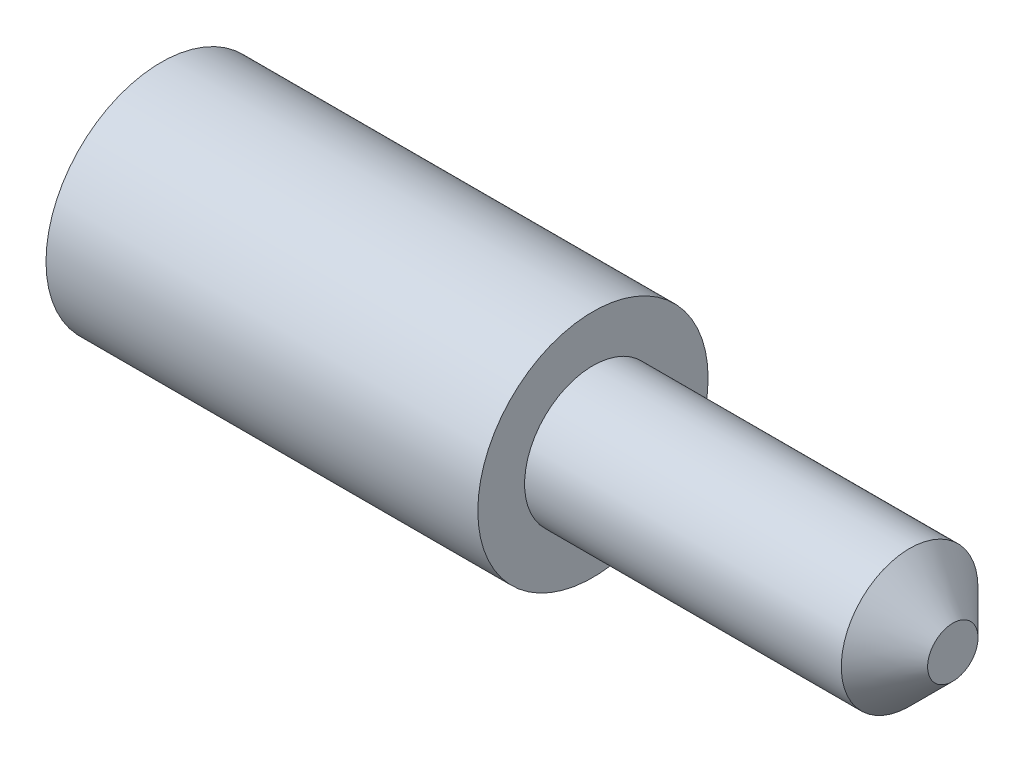
ISO-10303-21;
HEADER;
FILE_DESCRIPTION(('STEP AP214'),'2;1');
FILE_NAME('part.step','',(''),(''),'','','');
FILE_SCHEMA(('AUTOMOTIVE_DESIGN { 1 0 10303 214 1 1 1 1 }'));
ENDSEC;
DATA;
#1=APPLICATION_CONTEXT('core data for automotive mechanical design processes');
#2=APPLICATION_PROTOCOL_DEFINITION('international standard','automotive_design',2000,#1);
#3=PRODUCT_CONTEXT('',#1,'mechanical');
#4=PRODUCT('Part','Part','',(#3));
#5=PRODUCT_RELATED_PRODUCT_CATEGORY('part','',(#4));
#6=PRODUCT_DEFINITION_FORMATION('','',#4);
#7=PRODUCT_DEFINITION_CONTEXT('part definition',#1,'design');
#8=PRODUCT_DEFINITION('design','',#6,#7);
#9=PRODUCT_DEFINITION_SHAPE('','',#8);
#10=(LENGTH_UNIT() NAMED_UNIT(*) SI_UNIT(.MILLI.,.METRE.));
#11=(NAMED_UNIT(*) PLANE_ANGLE_UNIT() SI_UNIT($,.RADIAN.));
#12=(NAMED_UNIT(*) SI_UNIT($,.STERADIAN.) SOLID_ANGLE_UNIT());
#13=UNCERTAINTY_MEASURE_WITH_UNIT(LENGTH_MEASURE(1.E-05),#10,'distance_accuracy_value','');
#14=(GEOMETRIC_REPRESENTATION_CONTEXT(3) GLOBAL_UNCERTAINTY_ASSIGNED_CONTEXT((#13)) GLOBAL_UNIT_ASSIGNED_CONTEXT((#10,
#11,#12)) REPRESENTATION_CONTEXT('',''));
#15=CARTESIAN_POINT('',(0.,0.,0.));
#16=DIRECTION('',(0.,0.,1.));
#17=DIRECTION('',(1.,0.,0.));
#18=AXIS2_PLACEMENT_3D('',#15,#16,#17);
#19=CARTESIAN_POINT('',(-30.,0.,0.));
#20=DIRECTION('',(1.,0.,0.));
#21=DIRECTION('',(0.,0.,-1.));
#22=AXIS2_PLACEMENT_3D('',#19,#20,#21);
#23=CYLINDRICAL_SURFACE('',#22,8.);
#24=CARTESIAN_POINT('',(-30.,0.,0.));
#25=DIRECTION('',(1.,0.,0.));
#26=DIRECTION('',(0.,0.,-1.));
#27=AXIS2_PLACEMENT_3D('',#24,#25,#26);
#28=CIRCLE('',#27,8.);
#29=CARTESIAN_POINT('',(-30.,0.,-8.));
#30=VERTEX_POINT('',#29);
#31=EDGE_CURVE('E51',#30,#30,#28,.T.);
#32=ORIENTED_EDGE('',*,*,#31,.T.);
#33=EDGE_LOOP('',(#32));
#34=FACE_BOUND('',#33,.T.);
#35=CARTESIAN_POINT('',(0.,0.,0.));
#36=DIRECTION('',(1.,0.,0.));
#37=DIRECTION('',(0.,0.,-1.));
#38=AXIS2_PLACEMENT_3D('',#35,#36,#37);
#39=CIRCLE('',#38,8.);
#40=CARTESIAN_POINT('',(0.,0.,-8.));
#41=VERTEX_POINT('',#40);
#42=EDGE_CURVE('E54',#41,#41,#39,.T.);
#43=ORIENTED_EDGE('',*,*,#42,.F.);
#44=EDGE_LOOP('',(#43));
#45=FACE_BOUND('',#44,.T.);
#46=ADVANCED_FACE('F35',(#34,#45),#23,.T.);
#47=CARTESIAN_POINT('',(-30.,0.,0.));
#48=DIRECTION('',(1.,0.,0.));
#49=DIRECTION('',(0.,0.,-1.));
#50=AXIS2_PLACEMENT_3D('',#47,#48,#49);
#51=PLANE('',#50);
#52=ORIENTED_EDGE('',*,*,#31,.F.);
#53=EDGE_LOOP('',(#52));
#54=FACE_BOUND('',#53,.T.);
#55=ADVANCED_FACE('F62',(#54),#51,.F.);
#56=CARTESIAN_POINT('',(0.,0.,0.));
#57=DIRECTION('',(1.,0.,0.));
#58=DIRECTION('',(0.,0.,-1.));
#59=AXIS2_PLACEMENT_3D('',#56,#57,#58);
#60=PLANE('',#59);
#61=CARTESIAN_POINT('',(0.,0.,0.));
#62=DIRECTION('',(1.,0.,0.));
#63=DIRECTION('',(0.,0.,-1.));
#64=AXIS2_PLACEMENT_3D('',#61,#62,#63);
#65=CIRCLE('',#64,4.75);
#66=CARTESIAN_POINT('',(0.,0.,-4.75));
#67=VERTEX_POINT('',#66);
#68=EDGE_CURVE('E47',#67,#67,#65,.T.);
#69=ORIENTED_EDGE('',*,*,#68,.F.);
#70=EDGE_LOOP('',(#69));
#71=FACE_BOUND('',#70,.T.);
#72=ORIENTED_EDGE('',*,*,#42,.T.);
#73=EDGE_LOOP('',(#72));
#74=FACE_BOUND('',#73,.T.);
#75=ADVANCED_FACE('F64',(#71,#74),#60,.T.);
#76=CARTESIAN_POINT('',(25.,0.,0.));
#77=DIRECTION('',(-1.,0.,0.));
#78=DIRECTION('',(0.,0.,1.));
#79=AXIS2_PLACEMENT_3D('',#76,#77,#78);
#80=CYLINDRICAL_SURFACE('',#79,4.75);
#81=CARTESIAN_POINT('',(22.,0.,0.));
#82=DIRECTION('',(1.,0.,0.));
#83=DIRECTION('',(0.,0.,-1.));
#84=AXIS2_PLACEMENT_3D('',#81,#82,#83);
#85=CIRCLE('',#84,4.75);
#86=CARTESIAN_POINT('',(22.,0.,-4.75));
#87=VERTEX_POINT('',#86);
#88=EDGE_CURVE('E10',#87,#87,#85,.F.);
#89=ORIENTED_EDGE('',*,*,#88,.T.);
#90=EDGE_LOOP('',(#89));
#91=FACE_BOUND('',#90,.T.);
#92=ORIENTED_EDGE('',*,*,#68,.T.);
#93=EDGE_LOOP('',(#92));
#94=FACE_BOUND('',#93,.T.);
#95=ADVANCED_FACE('F70',(#91,#94),#80,.T.);
#96=CARTESIAN_POINT('',(25.,0.,0.));
#97=DIRECTION('',(1.,0.,0.));
#98=DIRECTION('',(0.,0.,-1.));
#99=AXIS2_PLACEMENT_3D('',#96,#97,#98);
#100=PLANE('',#99);
#101=CARTESIAN_POINT('',(25.,0.,0.));
#102=DIRECTION('',(1.,0.,0.));
#103=DIRECTION('',(0.,0.,-1.));
#104=AXIS2_PLACEMENT_3D('',#101,#102,#103);
#105=CIRCLE('',#104,1.74999999999998);
#106=CARTESIAN_POINT('',(25.,0.,-1.74999999999998));
#107=VERTEX_POINT('',#106);
#108=EDGE_CURVE('E43',#107,#107,#105,.T.);
#109=ORIENTED_EDGE('',*,*,#108,.T.);
#110=EDGE_LOOP('',(#109));
#111=FACE_BOUND('',#110,.T.);
#112=ADVANCED_FACE('F76',(#111),#100,.T.);
#113=CARTESIAN_POINT('',(25.,0.,0.));
#114=DIRECTION('',(-1.,0.,0.));
#115=DIRECTION('',(0.,0.,1.));
#116=AXIS2_PLACEMENT_3D('',#113,#114,#115);
#117=CONICAL_SURFACE('',#116,1.74999999999998,0.785398163397446);
#118=ORIENTED_EDGE('',*,*,#88,.F.);
#119=EDGE_LOOP('',(#118));
#120=FACE_BOUND('',#119,.T.);
#121=ORIENTED_EDGE('',*,*,#108,.F.);
#122=EDGE_LOOP('',(#121));
#123=FACE_BOUND('',#122,.T.);
#124=ADVANCED_FACE('F38',(#120,#123),#117,.T.);
#125=CLOSED_SHELL('',(#46,#55,#75,#95,#112,#124));
#126=MANIFOLD_SOLID_BREP('B2',#125);
#127=ADVANCED_BREP_SHAPE_REPRESENTATION('',(#18,#126),#14);
#128=SHAPE_DEFINITION_REPRESENTATION(#9,#127);
ENDSEC;
END-ISO-10303-21;
